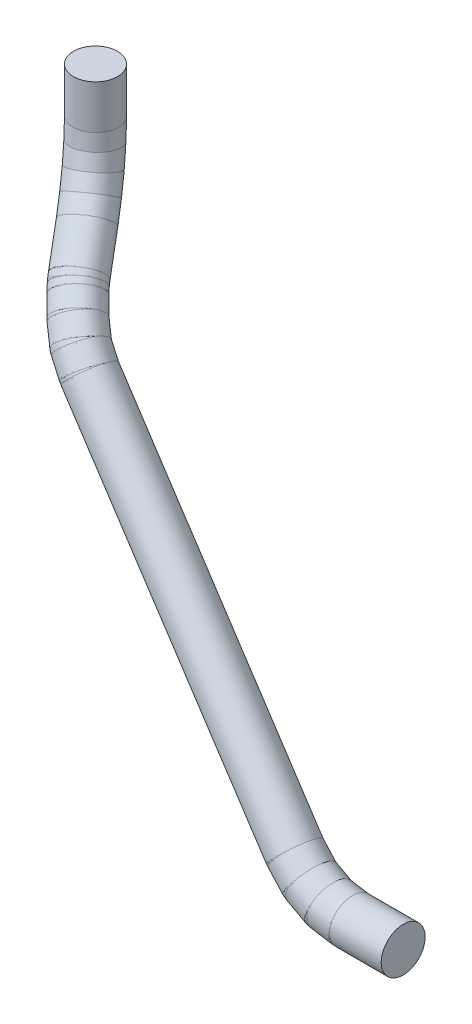
ISO-10303-21;
HEADER;
FILE_DESCRIPTION(('STEP AP214'),'2;1');
FILE_NAME('part.step','',(''),(''),'','','');
FILE_SCHEMA(('AUTOMOTIVE_DESIGN { 1 0 10303 214 1 1 1 1 }'));
ENDSEC;
DATA;
#1=APPLICATION_CONTEXT('core data for automotive mechanical design processes');
#2=APPLICATION_PROTOCOL_DEFINITION('international standard','automotive_design',2000,#1);
#3=PRODUCT_CONTEXT('',#1,'mechanical');
#4=PRODUCT('Part','Part','',(#3));
#5=PRODUCT_RELATED_PRODUCT_CATEGORY('part','',(#4));
#6=PRODUCT_DEFINITION_FORMATION('','',#4);
#7=PRODUCT_DEFINITION_CONTEXT('part definition',#1,'design');
#8=PRODUCT_DEFINITION('design','',#6,#7);
#9=PRODUCT_DEFINITION_SHAPE('','',#8);
#10=(LENGTH_UNIT() NAMED_UNIT(*) SI_UNIT(.MILLI.,.METRE.));
#11=(NAMED_UNIT(*) PLANE_ANGLE_UNIT() SI_UNIT($,.RADIAN.));
#12=(NAMED_UNIT(*) SI_UNIT($,.STERADIAN.) SOLID_ANGLE_UNIT());
#13=UNCERTAINTY_MEASURE_WITH_UNIT(LENGTH_MEASURE(1.E-05),#10,'distance_accuracy_value','');
#14=(GEOMETRIC_REPRESENTATION_CONTEXT(3) GLOBAL_UNCERTAINTY_ASSIGNED_CONTEXT((#13)) GLOBAL_UNIT_ASSIGNED_CONTEXT((#10,
#11,#12)) REPRESENTATION_CONTEXT('',''));
#15=CARTESIAN_POINT('',(0.,0.,0.));
#16=DIRECTION('',(0.,0.,1.));
#17=DIRECTION('',(1.,0.,0.));
#18=AXIS2_PLACEMENT_3D('',#15,#16,#17);
#19=CARTESIAN_POINT('',(-53.,-173.,205.));
#20=DIRECTION('',(-1.,0.,0.));
#21=DIRECTION('',(0.,0.,1.));
#22=AXIS2_PLACEMENT_3D('',#19,#20,#21);
#23=PLANE('',#22);
#24=CARTESIAN_POINT('',(-53.,-173.,205.));
#25=DIRECTION('',(-1.,0.,0.));
#26=DIRECTION('',(0.,0.,-1.));
#27=AXIS2_PLACEMENT_3D('',#24,#25,#26);
#28=CIRCLE('',#27,2.5);
#29=CARTESIAN_POINT('',(-53.,-173.,202.5));
#30=VERTEX_POINT('',#29);
#31=EDGE_CURVE('P0_E11',#30,#30,#28,.T.);
#32=ORIENTED_EDGE('',*,*,#31,.F.);
#33=EDGE_LOOP('',(#32));
#34=FACE_BOUND('',#33,.T.);
#35=ADVANCED_FACE('P0_F16',(#34),#23,.F.);
#36=CARTESIAN_POINT('',(-58.87238572424,-173.,205.));
#37=DIRECTION('',(-1.,0.,0.));
#38=DIRECTION('',(0.,0.,1.));
#39=AXIS2_PLACEMENT_3D('',#36,#37,#38);
#40=PLANE('',#39);
#41=CARTESIAN_POINT('',(-58.87238572424,-173.,205.));
#42=DIRECTION('',(-1.,0.,0.));
#43=DIRECTION('',(0.,0.,-1.));
#44=AXIS2_PLACEMENT_3D('',#41,#42,#43);
#45=CIRCLE('',#44,2.5);
#46=CARTESIAN_POINT('',(-58.87238572424,-173.,202.5));
#47=VERTEX_POINT('',#46);
#48=EDGE_CURVE('P0_E40',#47,#47,#45,.T.);
#49=ORIENTED_EDGE('',*,*,#48,.T.);
#50=EDGE_LOOP('',(#49));
#51=FACE_BOUND('',#50,.T.);
#52=ADVANCED_FACE('P0_F43',(#51),#40,.T.);
#53=CARTESIAN_POINT('',(-53.,-173.,205.));
#54=DIRECTION('',(-1.,0.,0.));
#55=DIRECTION('',(0.,0.,-1.));
#56=AXIS2_PLACEMENT_3D('',#53,#54,#55);
#57=CYLINDRICAL_SURFACE('',#56,2.5);
#58=ORIENTED_EDGE('',*,*,#48,.F.);
#59=DIRECTION('',(-1.,0.,0.));
#60=VECTOR('',#59,1.);
#61=CARTESIAN_POINT('',(-53.,-173.,202.5));
#62=LINE('',#61,#60);
#63=EDGE_CURVE('P0_E19',#30,#47,#62,.T.);
#64=ORIENTED_EDGE('',*,*,#63,.F.);
#65=ORIENTED_EDGE('',*,*,#31,.T.);
#66=ORIENTED_EDGE('',*,*,#63,.T.);
#67=EDGE_LOOP('',(#58,#64,#65,#66));
#68=FACE_BOUND('',#67,.T.);
#69=ADVANCED_FACE('P0_F39',(#68),#57,.T.);
#70=CLOSED_SHELL('',(#35,#52,#69));
#71=MANIFOLD_SOLID_BREP('P0_B1',#70);
#72=CARTESIAN_POINT('',(-58.87238572424,-173.,205.));
#73=DIRECTION('',(-0.991498732305096,0.126973144968012,-0.0284268235003328));
#74=DIRECTION('',(-0.0286587832479515,0.,0.999589252714707));
#75=AXIS2_PLACEMENT_3D('',#72,#73,#74);
#76=PLANE('',#75);
#77=CARTESIAN_POINT('',(-58.87238572424,-173.,205.));
#78=DIRECTION('',(-0.991498732305056,0.126973144968326,-0.0284268235003328));
#79=DIRECTION('',(-0.127024478583963,-0.991899582538713,0.));
#80=AXIS2_PLACEMENT_3D('',#77,#78,#79);
#81=CIRCLE('',#80,2.5);
#82=CARTESIAN_POINT('',(-59.1899469207,-175.4797489563,205.));
#83=VERTEX_POINT('',#82);
#84=EDGE_CURVE('P1_E11',#83,#83,#81,.T.);
#85=ORIENTED_EDGE('',*,*,#84,.F.);
#86=EDGE_LOOP('',(#85));
#87=FACE_BOUND('',#86,.T.);
#88=ADVANCED_FACE('P1_F16',(#87),#76,.F.);
#89=CARTESIAN_POINT('',(-61.45258959245,-172.6695743634,204.92602411121));
#90=DIRECTION('',(-0.991498732305096,0.126973144968012,-0.0284268235003328));
#91=DIRECTION('',(-0.0286587832479515,0.,0.999589252714707));
#92=AXIS2_PLACEMENT_3D('',#89,#90,#91);
#93=PLANE('',#92);
#94=CARTESIAN_POINT('',(-61.45258959245,-172.6695743634,204.92602411121));
#95=DIRECTION('',(-0.991498732305056,0.126973144968326,-0.0284268235003328));
#96=DIRECTION('',(-0.127024478583963,-0.991899582538713,0.));
#97=AXIS2_PLACEMENT_3D('',#94,#95,#96);
#98=CIRCLE('',#97,2.5);
#99=CARTESIAN_POINT('',(-61.77015078891,-175.1493233197,204.92602411121));
#100=VERTEX_POINT('',#99);
#101=EDGE_CURVE('P1_E19',#100,#100,#98,.T.);
#102=ORIENTED_EDGE('',*,*,#101,.T.);
#103=EDGE_LOOP('',(#102));
#104=FACE_BOUND('',#103,.T.);
#105=ADVANCED_FACE('P1_F44',(#104),#93,.T.);
#106=CARTESIAN_POINT('',(-58.87238572424,-173.,205.));
#107=DIRECTION('',(-0.991498732305056,0.126973144968326,-0.0284268235003328));
#108=DIRECTION('',(-0.127024478583963,-0.991899582538713,0.));
#109=AXIS2_PLACEMENT_3D('',#106,#107,#108);
#110=CYLINDRICAL_SURFACE('',#109,2.5);
#111=ORIENTED_EDGE('',*,*,#101,.F.);
#112=DIRECTION('',(-0.991498732305096,0.126973144968012,-0.0284268235003328));
#113=VECTOR('',#112,1.);
#114=CARTESIAN_POINT('',(-59.1899469207,-175.4797489563,205.));
#115=LINE('',#114,#113);
#116=EDGE_CURVE('P1_E25',#83,#100,#115,.T.);
#117=ORIENTED_EDGE('',*,*,#116,.F.);
#118=ORIENTED_EDGE('',*,*,#84,.T.);
#119=ORIENTED_EDGE('',*,*,#116,.T.);
#120=EDGE_LOOP('',(#111,#117,#118,#119));
#121=FACE_BOUND('',#120,.T.);
#122=ADVANCED_FACE('P1_F41',(#121),#110,.T.);
#123=CLOSED_SHELL('',(#88,#105,#122));
#124=MANIFOLD_SOLID_BREP('P1_B1',#123);
#125=CARTESIAN_POINT('',(-61.45258959245,-172.6695743634,204.92602411121));
#126=DIRECTION('',(-0.924353391775622,0.372320679525848,-0.0833553760132759));
#127=DIRECTION('',(-0.089812523834854,0.,0.995958689184654));
#128=AXIS2_PLACEMENT_3D('',#125,#126,#127);
#129=PLANE('',#128);
#130=CARTESIAN_POINT('',(-61.45258959245,-172.6695743634,204.92602411121));
#131=DIRECTION('',(-0.924353391775447,0.372320679526284,-0.0833553760132759));
#132=DIRECTION('',(-0.373620923289,-0.927581481963,0.));
#133=AXIS2_PLACEMENT_3D('',#130,#131,#132);
#134=CIRCLE('',#133,2.5);
#135=CARTESIAN_POINT('',(-62.38664190067,-174.9885280683,204.92602411121));
#136=VERTEX_POINT('',#135);
#137=EDGE_CURVE('P2_E11',#136,#136,#134,.T.);
#138=ORIENTED_EDGE('',*,*,#137,.F.);
#139=EDGE_LOOP('',(#138));
#140=FACE_BOUND('',#139,.T.);
#141=ADVANCED_FACE('P2_F16',(#140),#129,.F.);
#142=CARTESIAN_POINT('',(-63.85805933169,-171.7006742264,204.70910617009));
#143=DIRECTION('',(-0.924353391775622,0.372320679525848,-0.0833553760132759));
#144=DIRECTION('',(-0.089812523834854,0.,0.995958689184654));
#145=AXIS2_PLACEMENT_3D('',#142,#143,#144);
#146=PLANE('',#145);
#147=CARTESIAN_POINT('',(-63.85805933169,-171.7006742264,204.70910617009));
#148=DIRECTION('',(-0.924353391775447,0.372320679526284,-0.0833553760132759));
#149=DIRECTION('',(-0.373620923289,-0.927581481963,0.));
#150=AXIS2_PLACEMENT_3D('',#147,#148,#149);
#151=CIRCLE('',#150,2.5);
#152=CARTESIAN_POINT('',(-64.79211163991,-174.0196279313,204.70910617009));
#153=VERTEX_POINT('',#152);
#154=EDGE_CURVE('P2_E40',#153,#153,#151,.T.);
#155=ORIENTED_EDGE('',*,*,#154,.T.);
#156=EDGE_LOOP('',(#155));
#157=FACE_BOUND('',#156,.T.);
#158=ADVANCED_FACE('P2_F44',(#157),#146,.T.);
#159=CARTESIAN_POINT('',(-61.45258959245,-172.6695743634,204.92602411121));
#160=DIRECTION('',(-0.924353391775447,0.372320679526284,-0.0833553760132759));
#161=DIRECTION('',(-0.373620923289,-0.927581481963,0.));
#162=AXIS2_PLACEMENT_3D('',#159,#160,#161);
#163=CYLINDRICAL_SURFACE('',#162,2.5);
#164=ORIENTED_EDGE('',*,*,#154,.F.);
#165=DIRECTION('',(-0.924353391775622,0.372320679525848,-0.0833553760132759));
#166=VECTOR('',#165,1.);
#167=CARTESIAN_POINT('',(-62.38664190067,-174.9885280683,204.92602411121));
#168=LINE('',#167,#166);
#169=EDGE_CURVE('P2_E25',#136,#153,#168,.T.);
#170=ORIENTED_EDGE('',*,*,#169,.F.);
#171=ORIENTED_EDGE('',*,*,#137,.T.);
#172=ORIENTED_EDGE('',*,*,#169,.T.);
#173=EDGE_LOOP('',(#164,#170,#171,#172));
#174=FACE_BOUND('',#173,.T.);
#175=ADVANCED_FACE('P2_F39',(#174),#163,.T.);
#176=CLOSED_SHELL('',(#141,#158,#175));
#177=MANIFOLD_SOLID_BREP('P2_B1',#176);
#178=CARTESIAN_POINT('',(-63.85805933169,-171.7006742264,204.70910617009));
#179=DIRECTION('',(-0.794609864038896,0.592454264737922,-0.132639014493983));
#180=DIRECTION('',(-0.164645409222524,0.,0.986352821875594));
#181=AXIS2_PLACEMENT_3D('',#178,#179,#180);
#182=PLANE('',#181);
#183=CARTESIAN_POINT('',(-63.85805933169,-171.7006742264,204.70910617009));
#184=DIRECTION('',(-0.794609864039016,0.592454264737762,-0.132639014493983));
#185=DIRECTION('',(-0.597735610256958,-0.801693295612943,0.));
#186=AXIS2_PLACEMENT_3D('',#183,#184,#185);
#187=CIRCLE('',#186,2.5);
#188=CARTESIAN_POINT('',(-65.35239835733,-173.7049074654,204.70910617009));
#189=VERTEX_POINT('',#188);
#190=EDGE_CURVE('P3_E11',#189,#189,#187,.T.);
#191=ORIENTED_EDGE('',*,*,#190,.F.);
#192=EDGE_LOOP('',(#191));
#193=FACE_BOUND('',#192,.T.);
#194=ADVANCED_FACE('P3_F16',(#193),#182,.F.);
#195=CARTESIAN_POINT('',(-65.9258939926,-170.1589145289,204.36393608856));
#196=DIRECTION('',(-0.794609864038896,0.592454264737922,-0.132639014493983));
#197=DIRECTION('',(-0.164645409222524,0.,0.986352821875594));
#198=AXIS2_PLACEMENT_3D('',#195,#196,#197);
#199=PLANE('',#198);
#200=CARTESIAN_POINT('',(-65.9258939926,-170.1589145289,204.36393608856));
#201=DIRECTION('',(-0.794609864039016,0.592454264737762,-0.132639014493983));
#202=DIRECTION('',(-0.597735610256958,-0.801693295612943,0.));
#203=AXIS2_PLACEMENT_3D('',#200,#201,#202);
#204=CIRCLE('',#203,2.5);
#205=CARTESIAN_POINT('',(-67.42023301825,-172.1631477679,204.36393608856));
#206=VERTEX_POINT('',#205);
#207=EDGE_CURVE('P3_E40',#206,#206,#204,.T.);
#208=ORIENTED_EDGE('',*,*,#207,.T.);
#209=EDGE_LOOP('',(#208));
#210=FACE_BOUND('',#209,.T.);
#211=ADVANCED_FACE('P3_F44',(#210),#199,.T.);
#212=CARTESIAN_POINT('',(-63.85805933169,-171.7006742264,204.70910617009));
#213=DIRECTION('',(-0.794609864039016,0.592454264737762,-0.132639014493983));
#214=DIRECTION('',(-0.597735610256958,-0.801693295612943,0.));
#215=AXIS2_PLACEMENT_3D('',#212,#213,#214);
#216=CYLINDRICAL_SURFACE('',#215,2.5);
#217=ORIENTED_EDGE('',*,*,#207,.F.);
#218=DIRECTION('',(-0.794609864038896,0.592454264737923,-0.132639014493983));
#219=VECTOR('',#218,1.);
#220=CARTESIAN_POINT('',(-65.35239835733,-173.7049074654,204.70910617009));
#221=LINE('',#220,#219);
#222=EDGE_CURVE('P3_E25',#189,#206,#221,.T.);
#223=ORIENTED_EDGE('',*,*,#222,.F.);
#224=ORIENTED_EDGE('',*,*,#190,.T.);
#225=ORIENTED_EDGE('',*,*,#222,.T.);
#226=EDGE_LOOP('',(#217,#223,#224,#225));
#227=FACE_BOUND('',#226,.T.);
#228=ADVANCED_FACE('P3_F18',(#227),#216,.T.);
#229=CLOSED_SHELL('',(#194,#211,#228));
#230=MANIFOLD_SOLID_BREP('P3_B1',#229);
#231=CARTESIAN_POINT('',(-65.9258939926,-170.1589145289,204.36393608856));
#232=DIRECTION('',(-0.708858385774043,0.688311765896042,-0.15409964908101));
#233=DIRECTION('',(-0.212429644330643,0.,0.977176363922888));
#234=AXIS2_PLACEMENT_3D('',#231,#232,#233);
#235=PLANE('',#234);
#236=CARTESIAN_POINT('',(-65.9258939926,-170.1589145289,204.36393608856));
#237=DIRECTION('',(-0.70885838577409,0.688311765895993,-0.15409964908101));
#238=DIRECTION('',(-0.696632828179143,-0.717427837976147,0.));
#239=AXIS2_PLACEMENT_3D('',#236,#237,#238);
#240=CIRCLE('',#239,2.5);
#241=CARTESIAN_POINT('',(-67.66747606305,-171.9524841238,204.36393608856));
#242=VERTEX_POINT('',#241);
#243=EDGE_CURVE('P4_E11',#242,#242,#240,.T.);
#244=ORIENTED_EDGE('',*,*,#243,.F.);
#245=EDGE_LOOP('',(#244));
#246=FACE_BOUND('',#245,.T.);
#247=ADVANCED_FACE('P4_F16',(#246),#235,.F.);
#248=CARTESIAN_POINT('',(-95.83666687887,-141.1151205668,197.86159415676));
#249=DIRECTION('',(-0.708858385774043,0.688311765896042,-0.15409964908101));
#250=DIRECTION('',(-0.212429644330643,0.,0.977176363922888));
#251=AXIS2_PLACEMENT_3D('',#248,#249,#250);
#252=PLANE('',#251);
#253=CARTESIAN_POINT('',(-95.83666687887,-141.1151205668,197.86159415676));
#254=DIRECTION('',(-0.70885838577409,0.688311765895993,-0.15409964908101));
#255=DIRECTION('',(-0.696632828179143,-0.717427837976147,0.));
#256=AXIS2_PLACEMENT_3D('',#253,#254,#255);
#257=CIRCLE('',#256,2.5);
#258=CARTESIAN_POINT('',(-97.57824894932,-142.9086901618,197.86159415676));
#259=VERTEX_POINT('',#258);
#260=EDGE_CURVE('P4_E20',#259,#259,#257,.T.);
#261=ORIENTED_EDGE('',*,*,#260,.T.);
#262=EDGE_LOOP('',(#261));
#263=FACE_BOUND('',#262,.T.);
#264=ADVANCED_FACE('P4_F44',(#263),#252,.T.);
#265=CARTESIAN_POINT('',(-65.9258939926,-170.1589145289,204.36393608856));
#266=DIRECTION('',(-0.70885838577409,0.688311765895993,-0.15409964908101));
#267=DIRECTION('',(-0.696632828179143,-0.717427837976147,0.));
#268=AXIS2_PLACEMENT_3D('',#265,#266,#267);
#269=CYLINDRICAL_SURFACE('',#268,2.5);
#270=ORIENTED_EDGE('',*,*,#260,.F.);
#271=DIRECTION('',(-0.708858385774043,0.688311765896042,-0.15409964908101));
#272=VECTOR('',#271,1.);
#273=CARTESIAN_POINT('',(-67.66747606305,-171.9524841238,204.36393608856));
#274=LINE('',#273,#272);
#275=EDGE_CURVE('P4_E27',#242,#259,#274,.T.);
#276=ORIENTED_EDGE('',*,*,#275,.F.);
#277=ORIENTED_EDGE('',*,*,#243,.T.);
#278=ORIENTED_EDGE('',*,*,#275,.T.);
#279=EDGE_LOOP('',(#270,#276,#277,#278));
#280=FACE_BOUND('',#279,.T.);
#281=ADVANCED_FACE('P4_F18',(#280),#269,.T.);
#282=CLOSED_SHELL('',(#247,#264,#281));
#283=MANIFOLD_SOLID_BREP('P4_B1',#282);
#284=CARTESIAN_POINT('',(-95.83666687887,-141.1151205668,197.86159415676));
#285=DIRECTION('',(-0.689287029581941,0.673633721380942,-0.266647708162977));
#286=DIRECTION('',(-0.360790427810716,0.,0.93264691453956));
#287=AXIS2_PLACEMENT_3D('',#284,#285,#286);
#288=PLANE('',#287);
#289=CARTESIAN_POINT('',(-95.83666687887,-141.1151205668,197.86159415676));
#290=DIRECTION('',(-0.689287029581602,0.673633721381288,-0.266647708162977));
#291=DIRECTION('',(-0.698939478715806,-0.715180819857802,0.));
#292=AXIS2_PLACEMENT_3D('',#289,#290,#291);
#293=CIRCLE('',#292,2.5);
#294=CARTESIAN_POINT('',(-97.58401557566,-142.9030726165,197.86159415676));
#295=VERTEX_POINT('',#294);
#296=EDGE_CURVE('P5_E11',#295,#295,#293,.T.);
#297=ORIENTED_EDGE('',*,*,#296,.F.);
#298=EDGE_LOOP('',(#297));
#299=FACE_BOUND('',#298,.T.);
#300=ADVANCED_FACE('P5_F16',(#299),#288,.F.);
#301=CARTESIAN_POINT('',(-97.42182053998,-139.5659648249,197.2483843143));
#302=DIRECTION('',(-0.689287029581941,0.673633721380942,-0.266647708162977));
#303=DIRECTION('',(-0.360790427810716,0.,0.93264691453956));
#304=AXIS2_PLACEMENT_3D('',#301,#302,#303);
#305=PLANE('',#304);
#306=CARTESIAN_POINT('',(-97.42182053998,-139.5659648249,197.2483843143));
#307=DIRECTION('',(-0.689287029581602,0.673633721381288,-0.266647708162977));
#308=DIRECTION('',(-0.698939478715806,-0.715180819857802,0.));
#309=AXIS2_PLACEMENT_3D('',#306,#307,#308);
#310=CIRCLE('',#309,2.5);
#311=CARTESIAN_POINT('',(-99.16916923677,-141.3539168746,197.2483843143));
#312=VERTEX_POINT('',#311);
#313=EDGE_CURVE('P5_E40',#312,#312,#310,.T.);
#314=ORIENTED_EDGE('',*,*,#313,.T.);
#315=EDGE_LOOP('',(#314));
#316=FACE_BOUND('',#315,.T.);
#317=ADVANCED_FACE('P5_F44',(#316),#305,.T.);
#318=CARTESIAN_POINT('',(-95.83666687887,-141.1151205668,197.86159415676));
#319=DIRECTION('',(-0.689287029581602,0.673633721381288,-0.266647708162977));
#320=DIRECTION('',(-0.698939478715806,-0.715180819857802,0.));
#321=AXIS2_PLACEMENT_3D('',#318,#319,#320);
#322=CYLINDRICAL_SURFACE('',#321,2.5);
#323=ORIENTED_EDGE('',*,*,#313,.F.);
#324=DIRECTION('',(-0.689287029581941,0.673633721380942,-0.266647708162977));
#325=VECTOR('',#324,1.);
#326=CARTESIAN_POINT('',(-97.58401557566,-142.9030726165,197.86159415676));
#327=LINE('',#326,#325);
#328=EDGE_CURVE('P5_E25',#295,#312,#327,.T.);
#329=ORIENTED_EDGE('',*,*,#328,.F.);
#330=ORIENTED_EDGE('',*,*,#296,.T.);
#331=ORIENTED_EDGE('',*,*,#328,.T.);
#332=EDGE_LOOP('',(#323,#329,#330,#331));
#333=FACE_BOUND('',#332,.T.);
#334=ADVANCED_FACE('P5_F39',(#333),#322,.T.);
#335=CLOSED_SHELL('',(#300,#317,#334));
#336=MANIFOLD_SOLID_BREP('P5_B1',#335);
#337=CARTESIAN_POINT('',(-97.42182053998,-139.5659648249,197.2483843143));
#338=DIRECTION('',(-0.623093927383032,0.617782524646032,-0.479686053477025));
#339=DIRECTION('',(-0.610016738789293,0.,0.792388527426335));
#340=AXIS2_PLACEMENT_3D('',#337,#338,#339);
#341=PLANE('',#340);
#342=CARTESIAN_POINT('',(-97.42182053998,-139.5659648249,197.2483843143));
#343=DIRECTION('',(-0.62309392738321,0.617782524645854,-0.479686053477025));
#344=DIRECTION('',(-0.704073657046845,-0.710126950236844,0.));
#345=AXIS2_PLACEMENT_3D('',#342,#343,#344);
#346=CIRCLE('',#345,2.5);
#347=CARTESIAN_POINT('',(-99.1820046826,-141.3412822005,197.2483843143));
#348=VERTEX_POINT('',#347);
#349=EDGE_CURVE('P6_E11',#348,#348,#346,.T.);
#350=ORIENTED_EDGE('',*,*,#349,.F.);
#351=EDGE_LOOP('',(#350));
#352=FACE_BOUND('',#351,.T.);
#353=ADVANCED_FACE('P6_F16',(#352),#341,.F.);
#354=CARTESIAN_POINT('',(-98.85474989716,-138.1452501028,196.14525010283));
#355=DIRECTION('',(-0.623093927383032,0.617782524646032,-0.479686053477025));
#356=DIRECTION('',(-0.610016738789293,0.,0.792388527426335));
#357=AXIS2_PLACEMENT_3D('',#354,#355,#356);
#358=PLANE('',#357);
#359=CARTESIAN_POINT('',(-98.85474989716,-138.1452501028,196.14525010283));
#360=DIRECTION('',(-0.62309392738321,0.617782524645854,-0.479686053477025));
#361=DIRECTION('',(-0.704073657046845,-0.710126950236844,0.));
#362=AXIS2_PLACEMENT_3D('',#359,#360,#361);
#363=CIRCLE('',#362,2.5);
#364=CARTESIAN_POINT('',(-100.6149340397,-139.9205674784,196.14525010283));
#365=VERTEX_POINT('',#364);
#366=EDGE_CURVE('P6_E40',#365,#365,#363,.T.);
#367=ORIENTED_EDGE('',*,*,#366,.T.);
#368=EDGE_LOOP('',(#367));
#369=FACE_BOUND('',#368,.T.);
#370=ADVANCED_FACE('P6_F43',(#369),#358,.T.);
#371=CARTESIAN_POINT('',(-97.42182053998,-139.5659648249,197.2483843143));
#372=DIRECTION('',(-0.62309392738321,0.617782524645854,-0.479686053477025));
#373=DIRECTION('',(-0.704073657046845,-0.710126950236844,0.));
#374=AXIS2_PLACEMENT_3D('',#371,#372,#373);
#375=CYLINDRICAL_SURFACE('',#374,2.5);
#376=ORIENTED_EDGE('',*,*,#366,.F.);
#377=DIRECTION('',(-0.623093927383032,0.617782524646032,-0.479686053477025));
#378=VECTOR('',#377,1.);
#379=CARTESIAN_POINT('',(-99.1820046826,-141.3412822005,197.2483843143));
#380=LINE('',#379,#378);
#381=EDGE_CURVE('P6_E25',#348,#365,#380,.T.);
#382=ORIENTED_EDGE('',*,*,#381,.F.);
#383=ORIENTED_EDGE('',*,*,#349,.T.);
#384=ORIENTED_EDGE('',*,*,#381,.T.);
#385=EDGE_LOOP('',(#376,#382,#383,#384));
#386=FACE_BOUND('',#385,.T.);
#387=ADVANCED_FACE('P6_F39',(#386),#375,.T.);
#388=CLOSED_SHELL('',(#353,#370,#387));
#389=MANIFOLD_SOLID_BREP('P6_B1',#388);
#390=CARTESIAN_POINT('',(-98.85474989716,-138.1452501028,196.14525010283));
#391=DIRECTION('',(-0.577350269189626,0.577350269189626,-0.577350269189626));
#392=DIRECTION('',(-0.707106781186548,0.,0.707106781186548));
#393=AXIS2_PLACEMENT_3D('',#390,#391,#392);
#394=PLANE('',#393);
#395=CARTESIAN_POINT('',(-98.85474989716,-138.1452501028,196.14525010283));
#396=DIRECTION('',(-0.577350269189626,0.577350269189626,-0.577350269189626));
#397=DIRECTION('',(0.707106781186548,0.,-0.707106781186548));
#398=AXIS2_PLACEMENT_3D('',#395,#396,#397);
#399=CIRCLE('',#398,2.5);
#400=CARTESIAN_POINT('',(-97.0869829442,-138.1452501028,194.37748314986));
#401=VERTEX_POINT('',#400);
#402=EDGE_CURVE('P7_E11',#401,#401,#399,.T.);
#403=ORIENTED_EDGE('',*,*,#402,.F.);
#404=EDGE_LOOP('',(#403));
#405=FACE_BOUND('',#404,.T.);
#406=ADVANCED_FACE('P7_F16',(#405),#394,.F.);
#407=CARTESIAN_POINT('',(-100.0524807071,-136.9475192928,194.94751929283));
#408=DIRECTION('',(-0.577350269189626,0.577350269189626,-0.577350269189626));
#409=DIRECTION('',(-0.707106781186548,0.,0.707106781186548));
#410=AXIS2_PLACEMENT_3D('',#407,#408,#409);
#411=PLANE('',#410);
#412=CARTESIAN_POINT('',(-100.0524807071,-136.9475192928,194.94751929283));
#413=DIRECTION('',(-0.577350269189626,0.577350269189626,-0.577350269189626));
#414=DIRECTION('',(0.707106781186548,0.,-0.707106781186548));
#415=AXIS2_PLACEMENT_3D('',#412,#413,#414);
#416=CIRCLE('',#415,2.5);
#417=CARTESIAN_POINT('',(-98.28471375419,-136.9475192928,193.17975233987));
#418=VERTEX_POINT('',#417);
#419=EDGE_CURVE('P7_E42',#418,#418,#416,.T.);
#420=ORIENTED_EDGE('',*,*,#419,.T.);
#421=EDGE_LOOP('',(#420));
#422=FACE_BOUND('',#421,.T.);
#423=ADVANCED_FACE('P7_F18',(#422),#411,.T.);
#424=CARTESIAN_POINT('',(-98.85474989716,-138.1452501028,196.14525010283));
#425=DIRECTION('',(-0.577350269189626,0.577350269189626,-0.577350269189626));
#426=DIRECTION('',(0.707106781186548,0.,-0.707106781186548));
#427=AXIS2_PLACEMENT_3D('',#424,#425,#426);
#428=CYLINDRICAL_SURFACE('',#427,2.5);
#429=ORIENTED_EDGE('',*,*,#419,.F.);
#430=DIRECTION('',(-0.577350269189626,0.577350269189626,-0.577350269189626));
#431=VECTOR('',#430,1.);
#432=CARTESIAN_POINT('',(-97.0869829442,-138.1452501028,194.37748314986));
#433=LINE('',#432,#431);
#434=EDGE_CURVE('P7_E20',#401,#418,#433,.T.);
#435=ORIENTED_EDGE('',*,*,#434,.F.);
#436=ORIENTED_EDGE('',*,*,#402,.T.);
#437=ORIENTED_EDGE('',*,*,#434,.T.);
#438=EDGE_LOOP('',(#429,#435,#436,#437));
#439=FACE_BOUND('',#438,.T.);
#440=ADVANCED_FACE('P7_F41',(#439),#428,.T.);
#441=CLOSED_SHELL('',(#406,#423,#440));
#442=MANIFOLD_SOLID_BREP('P7_B1',#441);
#443=CARTESIAN_POINT('',(-100.0524807071,-136.9475192928,194.94751929283));
#444=DIRECTION('',(-0.54547545539505,0.590157601325054,-0.595122284207054));
#445=DIRECTION('',(-0.737187029679512,0.,0.675688747332896));
#446=AXIS2_PLACEMENT_3D('',#443,#444,#445);
#447=PLANE('',#446);
#448=CARTESIAN_POINT('',(-100.0524807071,-136.9475192928,194.94751929283));
#449=DIRECTION('',(-0.54547545539505,0.590157601325429,-0.595122284206682));
#450=DIRECTION('',(0.,-0.710062351494822,-0.704138805200824));
#451=AXIS2_PLACEMENT_3D('',#448,#449,#450);
#452=CIRCLE('',#451,2.5);
#453=CARTESIAN_POINT('',(-100.0524807071,-138.7226751715,193.18717227983));
#454=VERTEX_POINT('',#453);
#455=EDGE_CURVE('P8_E11',#454,#454,#452,.T.);
#456=ORIENTED_EDGE('',*,*,#455,.F.);
#457=EDGE_LOOP('',(#456));
#458=FACE_BOUND('',#457,.T.);
#459=ADVANCED_FACE('P8_F16',(#458),#447,.F.);
#460=CARTESIAN_POINT('',(-100.4743440493,-136.491099383,194.48725976447));
#461=DIRECTION('',(-0.54547545539505,0.590157601325054,-0.595122284207054));
#462=DIRECTION('',(-0.737187029679512,0.,0.675688747332896));
#463=AXIS2_PLACEMENT_3D('',#460,#461,#462);
#464=PLANE('',#463);
#465=CARTESIAN_POINT('',(-100.4743440493,-136.491099383,194.48725976447));
#466=DIRECTION('',(-0.54547545539505,0.590157601325429,-0.595122284206682));
#467=DIRECTION('',(0.,-0.710062351494822,-0.704138805200824));
#468=AXIS2_PLACEMENT_3D('',#465,#466,#467);
#469=CIRCLE('',#468,2.5);
#470=CARTESIAN_POINT('',(-100.4743440493,-138.2662552618,192.72691275147));
#471=VERTEX_POINT('',#470);
#472=EDGE_CURVE('P8_E20',#471,#471,#469,.T.);
#473=ORIENTED_EDGE('',*,*,#472,.T.);
#474=EDGE_LOOP('',(#473));
#475=FACE_BOUND('',#474,.T.);
#476=ADVANCED_FACE('P8_F44',(#475),#464,.T.);
#477=CARTESIAN_POINT('',(-100.0524807071,-136.9475192928,194.94751929283));
#478=DIRECTION('',(-0.54547545539505,0.590157601325429,-0.595122284206682));
#479=DIRECTION('',(0.,-0.710062351494822,-0.704138805200824));
#480=AXIS2_PLACEMENT_3D('',#477,#478,#479);
#481=CYLINDRICAL_SURFACE('',#480,2.5);
#482=ORIENTED_EDGE('',*,*,#472,.F.);
#483=DIRECTION('',(-0.54547545539505,0.590157601325054,-0.595122284207054));
#484=VECTOR('',#483,1.);
#485=CARTESIAN_POINT('',(-100.0524807071,-138.7226751715,193.18717227983));
#486=LINE('',#485,#484);
#487=EDGE_CURVE('P8_E27',#454,#471,#486,.T.);
#488=ORIENTED_EDGE('',*,*,#487,.F.);
#489=ORIENTED_EDGE('',*,*,#455,.T.);
#490=ORIENTED_EDGE('',*,*,#487,.T.);
#491=EDGE_LOOP('',(#482,#488,#489,#490));
#492=FACE_BOUND('',#491,.T.);
#493=ADVANCED_FACE('P8_F18',(#492),#481,.T.);
#494=CLOSED_SHELL('',(#459,#476,#493));
#495=MANIFOLD_SOLID_BREP('P8_B1',#494);
#496=CARTESIAN_POINT('',(-100.4743440493,-136.491099383,194.48725976447));
#497=DIRECTION('',(-0.47932683818292,0.613106020151898,-0.627970373704895));
#498=DIRECTION('',(-0.794898565256991,0.,0.606742343134528));
#499=AXIS2_PLACEMENT_3D('',#496,#497,#498);
#500=PLANE('',#499);
#501=CARTESIAN_POINT('',(-100.4743440493,-136.491099383,194.48725976447));
#502=DIRECTION('',(-0.47932683818292,0.613106020152429,-0.627970373704376));
#503=DIRECTION('',(0.,-0.715524470112668,-0.698587669995675));
#504=AXIS2_PLACEMENT_3D('',#501,#502,#503);
#505=CIRCLE('',#504,2.5);
#506=CARTESIAN_POINT('',(-100.4743440493,-138.2799105583,192.74079058948));
#507=VERTEX_POINT('',#506);
#508=EDGE_CURVE('P9_E11',#507,#507,#505,.T.);
#509=ORIENTED_EDGE('',*,*,#508,.F.);
#510=EDGE_LOOP('',(#509));
#511=FACE_BOUND('',#510,.T.);
#512=ADVANCED_FACE('P9_F16',(#511),#500,.F.);
#513=CARTESIAN_POINT('',(-100.8450489453,-136.0169314765,194.00159596781));
#514=DIRECTION('',(-0.47932683818292,0.613106020151898,-0.627970373704895));
#515=DIRECTION('',(-0.794898565256991,0.,0.606742343134528));
#516=AXIS2_PLACEMENT_3D('',#513,#514,#515);
#517=PLANE('',#516);
#518=CARTESIAN_POINT('',(-100.8450489453,-136.0169314765,194.00159596781));
#519=DIRECTION('',(-0.47932683818292,0.613106020152429,-0.627970373704376));
#520=DIRECTION('',(0.,-0.715524470112668,-0.698587669995675));
#521=AXIS2_PLACEMENT_3D('',#518,#519,#520);
#522=CIRCLE('',#521,2.5);
#523=CARTESIAN_POINT('',(-100.8450489453,-137.8057426517,192.25512679283));
#524=VERTEX_POINT('',#523);
#525=EDGE_CURVE('P9_E40',#524,#524,#522,.T.);
#526=ORIENTED_EDGE('',*,*,#525,.T.);
#527=EDGE_LOOP('',(#526));
#528=FACE_BOUND('',#527,.T.);
#529=ADVANCED_FACE('P9_F43',(#528),#517,.T.);
#530=CARTESIAN_POINT('',(-100.4743440493,-136.491099383,194.48725976447));
#531=DIRECTION('',(-0.47932683818292,0.61310602015243,-0.627970373704376));
#532=DIRECTION('',(0.,-0.715524470112668,-0.698587669995675));
#533=AXIS2_PLACEMENT_3D('',#530,#531,#532);
#534=CYLINDRICAL_SURFACE('',#533,2.5);
#535=ORIENTED_EDGE('',*,*,#525,.F.);
#536=DIRECTION('',(-0.47932683818292,0.613106020151898,-0.627970373704895));
#537=VECTOR('',#536,1.);
#538=CARTESIAN_POINT('',(-100.4743440493,-138.2799105583,192.74079058948));
#539=LINE('',#538,#537);
#540=EDGE_CURVE('P9_E26',#507,#524,#539,.T.);
#541=ORIENTED_EDGE('',*,*,#540,.F.);
#542=ORIENTED_EDGE('',*,*,#508,.T.);
#543=ORIENTED_EDGE('',*,*,#540,.T.);
#544=EDGE_LOOP('',(#535,#541,#542,#543));
#545=FACE_BOUND('',#544,.T.);
#546=ADVANCED_FACE('P9_F18',(#545),#534,.T.);
#547=CLOSED_SHELL('',(#512,#529,#546));
#548=MANIFOLD_SOLID_BREP('P9_B1',#547);
#549=CARTESIAN_POINT('',(-100.8450489453,-136.0169314765,194.00159596781));
#550=DIRECTION('',(-0.445151984895871,0.62321277885382,-0.642997311515814));
#551=DIRECTION('',(-0.822192191643595,0.,0.569209978830574));
#552=AXIS2_PLACEMENT_3D('',#549,#550,#551);
#553=PLANE('',#552);
#554=CARTESIAN_POINT('',(-100.8450489453,-136.0169314765,194.00159596781));
#555=DIRECTION('',(-0.445151984895871,0.623212778854067,-0.642997311515575));
#556=DIRECTION('',(0.,-0.718067675246157,-0.695973285239153));
#557=AXIS2_PLACEMENT_3D('',#554,#555,#556);
#558=CIRCLE('',#557,2.5);
#559=CARTESIAN_POINT('',(-100.8450489453,-137.8121006646,192.26166275472));
#560=VERTEX_POINT('',#559);
#561=EDGE_CURVE('P10_E11',#560,#560,#558,.T.);
#562=ORIENTED_EDGE('',*,*,#561,.F.);
#563=EDGE_LOOP('',(#562));
#564=FACE_BOUND('',#563,.T.);
#565=ADVANCED_FACE('P10_F16',(#564),#553,.F.);
#566=CARTESIAN_POINT('',(-102.8552895382,-133.2025946464,191.09791511137));
#567=DIRECTION('',(-0.445151984895871,0.62321277885382,-0.642997311515814));
#568=DIRECTION('',(-0.822192191643595,0.,0.569209978830574));
#569=AXIS2_PLACEMENT_3D('',#566,#567,#568);
#570=PLANE('',#569);
#571=CARTESIAN_POINT('',(-102.8552895382,-133.2025946464,191.09791511137));
#572=DIRECTION('',(-0.445151984895871,0.623212778854067,-0.642997311515575));
#573=DIRECTION('',(0.,-0.718067675246157,-0.695973285239153));
#574=AXIS2_PLACEMENT_3D('',#571,#572,#573);
#575=CIRCLE('',#574,2.5);
#576=CARTESIAN_POINT('',(-102.8552895382,-134.9977638345,189.35798189827));
#577=VERTEX_POINT('',#576);
#578=EDGE_CURVE('P10_E41',#577,#577,#575,.T.);
#579=ORIENTED_EDGE('',*,*,#578,.T.);
#580=EDGE_LOOP('',(#579));
#581=FACE_BOUND('',#580,.T.);
#582=ADVANCED_FACE('P10_F44',(#581),#570,.T.);
#583=CARTESIAN_POINT('',(-100.8450489453,-136.0169314765,194.00159596781));
#584=DIRECTION('',(-0.445151984895871,0.623212778854067,-0.642997311515575));
#585=DIRECTION('',(0.,-0.718067675246157,-0.695973285239153));
#586=AXIS2_PLACEMENT_3D('',#583,#584,#585);
#587=CYLINDRICAL_SURFACE('',#586,2.5);
#588=ORIENTED_EDGE('',*,*,#578,.F.);
#589=DIRECTION('',(-0.445151984895871,0.62321277885382,-0.642997311515814));
#590=VECTOR('',#589,1.);
#591=CARTESIAN_POINT('',(-100.8450489453,-137.8121006646,192.26166275472));
#592=LINE('',#591,#590);
#593=EDGE_CURVE('P10_E19',#560,#577,#592,.T.);
#594=ORIENTED_EDGE('',*,*,#593,.F.);
#595=ORIENTED_EDGE('',*,*,#561,.T.);
#596=ORIENTED_EDGE('',*,*,#593,.T.);
#597=EDGE_LOOP('',(#588,#594,#595,#596));
#598=FACE_BOUND('',#597,.T.);
#599=ADVANCED_FACE('P10_F40',(#598),#587,.T.);
#600=CLOSED_SHELL('',(#565,#582,#599));
#601=MANIFOLD_SOLID_BREP('P10_B1',#600);
#602=CARTESIAN_POINT('',(-102.8552895382,-133.2025946464,191.09791511137));
#603=DIRECTION('',(-0.402616985670062,0.706887550319109,-0.58155786819009));
#604=DIRECTION('',(-0.822192191643779,0.,0.569209978830308));
#605=AXIS2_PLACEMENT_3D('',#602,#603,#604);
#606=PLANE('',#605);
#607=CARTESIAN_POINT('',(-102.8552895382,-133.2025946464,191.09791511137));
#608=DIRECTION('',(-0.402616985670062,0.706887550319137,-0.581557868190056));
#609=DIRECTION('',(0.,0.635326475822189,0.772243659164229));
#610=AXIS2_PLACEMENT_3D('',#607,#608,#609);
#611=CIRCLE('',#610,2.5);
#612=CARTESIAN_POINT('',(-102.8552895382,-131.6142784568,193.02852425928));
#613=VERTEX_POINT('',#612);
#614=EDGE_CURVE('P11_E11',#613,#613,#611,.T.);
#615=ORIENTED_EDGE('',*,*,#614,.F.);
#616=EDGE_LOOP('',(#615));
#617=FACE_BOUND('',#616,.T.);
#618=ADVANCED_FACE('P11_F16',(#617),#606,.F.);
#619=CARTESIAN_POINT('',(-103.7572198861,-131.6190466172,189.79512683112));
#620=DIRECTION('',(-0.402616985670062,0.706887550319109,-0.58155786819009));
#621=DIRECTION('',(-0.822192191643779,0.,0.569209978830308));
#622=AXIS2_PLACEMENT_3D('',#619,#620,#621);
#623=PLANE('',#622);
#624=CARTESIAN_POINT('',(-103.7572198861,-131.6190466172,189.79512683112));
#625=DIRECTION('',(-0.402616985670062,0.706887550319137,-0.581557868190056));
#626=DIRECTION('',(0.,0.635326475822189,0.772243659164229));
#627=AXIS2_PLACEMENT_3D('',#624,#625,#626);
#628=CIRCLE('',#627,2.5);
#629=CARTESIAN_POINT('',(-103.7572198861,-130.0307304276,191.72573597903));
#630=VERTEX_POINT('',#629);
#631=EDGE_CURVE('P11_E40',#630,#630,#628,.T.);
#632=ORIENTED_EDGE('',*,*,#631,.T.);
#633=EDGE_LOOP('',(#632));
#634=FACE_BOUND('',#633,.T.);
#635=ADVANCED_FACE('P11_F44',(#634),#623,.T.);
#636=CARTESIAN_POINT('',(-102.8552895382,-133.2025946464,191.09791511137));
#637=DIRECTION('',(-0.402616985670062,0.706887550319137,-0.581557868190056));
#638=DIRECTION('',(0.,0.635326475822189,0.772243659164229));
#639=AXIS2_PLACEMENT_3D('',#636,#637,#638);
#640=CYLINDRICAL_SURFACE('',#639,2.5);
#641=ORIENTED_EDGE('',*,*,#631,.F.);
#642=DIRECTION('',(-0.402616985670062,0.706887550319109,-0.58155786819009));
#643=VECTOR('',#642,1.);
#644=CARTESIAN_POINT('',(-102.8552895382,-131.6142784568,193.02852425928));
#645=LINE('',#644,#643);
#646=EDGE_CURVE('P11_E24',#613,#630,#645,.T.);
#647=ORIENTED_EDGE('',*,*,#646,.F.);
#648=ORIENTED_EDGE('',*,*,#614,.T.);
#649=ORIENTED_EDGE('',*,*,#646,.T.);
#650=EDGE_LOOP('',(#641,#647,#648,#649));
#651=FACE_BOUND('',#650,.T.);
#652=ADVANCED_FACE('P11_F39',(#651),#640,.T.);
#653=CLOSED_SHELL('',(#618,#635,#652));
#654=MANIFOLD_SOLID_BREP('P11_B1',#653);
#655=CARTESIAN_POINT('',(-103.7572198861,-131.6190466172,189.79512683112));
#656=DIRECTION('',(-0.302944677134144,0.846606374705404,-0.437586755860209));
#657=DIRECTION('',(-0.822192191643643,0.,0.569209978830504));
#658=AXIS2_PLACEMENT_3D('',#655,#656,#657);
#659=PLANE('',#658);
#660=CARTESIAN_POINT('',(-103.7572198861,-131.6190466172,189.79512683112));
#661=DIRECTION('',(-0.302944677134144,0.846606374705281,-0.437586755860447));
#662=DIRECTION('',(0.,0.459163710824075,0.888351668351146));
#663=AXIS2_PLACEMENT_3D('',#660,#661,#662);
#664=CIRCLE('',#663,2.5);
#665=CARTESIAN_POINT('',(-103.7572198861,-130.4711373401,192.016006002));
#666=VERTEX_POINT('',#665);
#667=EDGE_CURVE('P12_E11',#666,#666,#664,.T.);
#668=ORIENTED_EDGE('',*,*,#667,.F.);
#669=EDGE_LOOP('',(#668));
#670=FACE_BOUND('',#669,.T.);
#671=ADVANCED_FACE('P12_F16',(#670),#659,.F.);
#672=CARTESIAN_POINT('',(-104.4358673544,-129.7225047195,188.81485826575));
#673=DIRECTION('',(-0.302944677134144,0.846606374705404,-0.437586755860209));
#674=DIRECTION('',(-0.822192191643643,0.,0.569209978830504));
#675=AXIS2_PLACEMENT_3D('',#672,#673,#674);
#676=PLANE('',#675);
#677=CARTESIAN_POINT('',(-104.4358673544,-129.7225047195,188.81485826575));
#678=DIRECTION('',(-0.302944677134144,0.846606374705281,-0.437586755860447));
#679=DIRECTION('',(0.,0.459163710824075,0.888351668351146));
#680=AXIS2_PLACEMENT_3D('',#677,#678,#679);
#681=CIRCLE('',#680,2.5);
#682=CARTESIAN_POINT('',(-104.4358673544,-128.5745954425,191.03573743663));
#683=VERTEX_POINT('',#682);
#684=EDGE_CURVE('P12_E40',#683,#683,#681,.T.);
#685=ORIENTED_EDGE('',*,*,#684,.T.);
#686=EDGE_LOOP('',(#685));
#687=FACE_BOUND('',#686,.T.);
#688=ADVANCED_FACE('P12_F43',(#687),#676,.T.);
#689=CARTESIAN_POINT('',(-103.7572198861,-131.6190466172,189.79512683112));
#690=DIRECTION('',(-0.302944677134144,0.846606374705281,-0.437586755860447));
#691=DIRECTION('',(0.,0.459163710824075,0.888351668351146));
#692=AXIS2_PLACEMENT_3D('',#689,#690,#691);
#693=CYLINDRICAL_SURFACE('',#692,2.5);
#694=ORIENTED_EDGE('',*,*,#684,.F.);
#695=DIRECTION('',(-0.302944677134144,0.846606374705404,-0.437586755860209));
#696=VECTOR('',#695,1.);
#697=CARTESIAN_POINT('',(-103.7572198861,-130.4711373401,192.016006002));
#698=LINE('',#697,#696);
#699=EDGE_CURVE('P12_E25',#666,#683,#698,.T.);
#700=ORIENTED_EDGE('',*,*,#699,.F.);
#701=ORIENTED_EDGE('',*,*,#667,.T.);
#702=ORIENTED_EDGE('',*,*,#699,.T.);
#703=EDGE_LOOP('',(#694,#700,#701,#702));
#704=FACE_BOUND('',#703,.T.);
#705=ADVANCED_FACE('P12_F18',(#704),#693,.T.);
#706=CLOSED_SHELL('',(#671,#688,#705));
#707=MANIFOLD_SOLID_BREP('P12_B1',#706);
#708=CARTESIAN_POINT('',(-104.4358673544,-129.7225047195,188.81485826575));
#709=DIRECTION('',(-0.188069514049923,0.94383944328861,-0.271655964737888));
#710=DIRECTION('',(-0.822192191642907,0.,0.569209978831567));
#711=AXIS2_PLACEMENT_3D('',#708,#709,#710);
#712=PLANE('',#711);
#713=CARTESIAN_POINT('',(-104.4358673544,-129.7225047195,188.81485826575));
#714=DIRECTION('',(-0.188069514049923,0.943839443288438,-0.271655964738486));
#715=DIRECTION('',(0.,0.276591541716991,0.960987574867968));
#716=AXIS2_PLACEMENT_3D('',#713,#714,#715);
#717=CIRCLE('',#716,2.5);
#718=CARTESIAN_POINT('',(-104.4358673544,-129.0310258652,191.21732720292));
#719=VERTEX_POINT('',#718);
#720=EDGE_CURVE('P13_E11',#719,#719,#717,.T.);
#721=ORIENTED_EDGE('',*,*,#720,.F.);
#722=EDGE_LOOP('',(#721));
#723=FACE_BOUND('',#722,.T.);
#724=ADVANCED_FACE('P13_F16',(#723),#712,.F.);
#725=CARTESIAN_POINT('',(-104.85717497,-127.6081442536,188.206302821));
#726=DIRECTION('',(-0.188069514049923,0.94383944328861,-0.271655964737888));
#727=DIRECTION('',(-0.822192191642907,0.,0.569209978831567));
#728=AXIS2_PLACEMENT_3D('',#725,#726,#727);
#729=PLANE('',#728);
#730=CARTESIAN_POINT('',(-104.85717497,-127.6081442536,188.206302821));
#731=DIRECTION('',(-0.188069514049923,0.943839443288438,-0.271655964738486));
#732=DIRECTION('',(0.,0.276591541716991,0.960987574867968));
#733=AXIS2_PLACEMENT_3D('',#730,#731,#732);
#734=CIRCLE('',#733,2.5);
#735=CARTESIAN_POINT('',(-104.85717497,-126.9166653993,190.60877175817));
#736=VERTEX_POINT('',#735);
#737=EDGE_CURVE('P13_E41',#736,#736,#734,.T.);
#738=ORIENTED_EDGE('',*,*,#737,.T.);
#739=EDGE_LOOP('',(#738));
#740=FACE_BOUND('',#739,.T.);
#741=ADVANCED_FACE('P13_F44',(#740),#729,.T.);
#742=CARTESIAN_POINT('',(-104.4358673544,-129.7225047195,188.81485826575));
#743=DIRECTION('',(-0.188069514049923,0.943839443288438,-0.271655964738486));
#744=DIRECTION('',(0.,0.276591541716991,0.960987574867968));
#745=AXIS2_PLACEMENT_3D('',#742,#743,#744);
#746=CYLINDRICAL_SURFACE('',#745,2.5);
#747=ORIENTED_EDGE('',*,*,#737,.F.);
#748=DIRECTION('',(-0.188069514049923,0.94383944328861,-0.271655964737888));
#749=VECTOR('',#748,1.);
#750=CARTESIAN_POINT('',(-104.4358673544,-129.0310258652,191.21732720292));
#751=LINE('',#750,#749);
#752=EDGE_CURVE('P13_E19',#719,#736,#751,.T.);
#753=ORIENTED_EDGE('',*,*,#752,.F.);
#754=ORIENTED_EDGE('',*,*,#720,.T.);
#755=ORIENTED_EDGE('',*,*,#752,.T.);
#756=EDGE_LOOP('',(#747,#753,#754,#755));
#757=FACE_BOUND('',#756,.T.);
#758=ADVANCED_FACE('P13_F40',(#757),#746,.T.);
#759=CLOSED_SHELL('',(#724,#741,#758));
#760=MANIFOLD_SOLID_BREP('P13_B1',#759);
#761=CARTESIAN_POINT('',(-104.85717497,-127.6081442536,188.206302821));
#762=DIRECTION('',(-0.0637563456695475,0.993707250632429,-0.0920924993004597));
#763=DIRECTION('',(-0.822192191643785,0.,0.569209978830299));
#764=AXIS2_PLACEMENT_3D('',#761,#762,#763);
#765=PLANE('',#764);
#766=CARTESIAN_POINT('',(-104.85717497,-127.6081442536,188.206302821));
#767=DIRECTION('',(-0.0637563456695475,0.993707250632432,-0.0920924993004203));
#768=DIRECTION('',(0.,0.0922802439562349,0.995733074963054));
#769=AXIS2_PLACEMENT_3D('',#766,#767,#768);
#770=CIRCLE('',#769,2.5);
#771=CARTESIAN_POINT('',(-104.85717497,-127.3774436437,190.69563550841));
#772=VERTEX_POINT('',#771);
#773=EDGE_CURVE('P14_E11',#772,#772,#770,.T.);
#774=ORIENTED_EDGE('',*,*,#773,.F.);
#775=EDGE_LOOP('',(#774));
#776=FACE_BOUND('',#775,.T.);
#777=ADVANCED_FACE('P14_F16',(#776),#765,.F.);
#778=CARTESIAN_POINT('',(-105.,-125.3820714396,188.));
#779=DIRECTION('',(-0.0637563456695475,0.993707250632429,-0.0920924993004597));
#780=DIRECTION('',(-0.822192191643785,0.,0.569209978830299));
#781=AXIS2_PLACEMENT_3D('',#778,#779,#780);
#782=PLANE('',#781);
#783=CARTESIAN_POINT('',(-105.,-125.3820714396,188.));
#784=DIRECTION('',(-0.0637563456695475,0.993707250632432,-0.0920924993004203));
#785=DIRECTION('',(0.,0.0922802439562349,0.995733074963054));
#786=AXIS2_PLACEMENT_3D('',#783,#784,#785);
#787=CIRCLE('',#786,2.5);
#788=CARTESIAN_POINT('',(-105.,-125.1513708297,190.4893326874));
#789=VERTEX_POINT('',#788);
#790=EDGE_CURVE('P14_E19',#789,#789,#787,.T.);
#791=ORIENTED_EDGE('',*,*,#790,.T.);
#792=EDGE_LOOP('',(#791));
#793=FACE_BOUND('',#792,.T.);
#794=ADVANCED_FACE('P14_F44',(#793),#782,.T.);
#795=CARTESIAN_POINT('',(-104.85717497,-127.6081442536,188.206302821));
#796=DIRECTION('',(-0.0637563456695475,0.993707250632432,-0.0920924993004203));
#797=DIRECTION('',(0.,0.092280243956235,0.995733074963054));
#798=AXIS2_PLACEMENT_3D('',#795,#796,#797);
#799=CYLINDRICAL_SURFACE('',#798,2.5);
#800=ORIENTED_EDGE('',*,*,#790,.F.);
#801=DIRECTION('',(-0.0637563456695475,0.993707250632429,-0.0920924993004597));
#802=VECTOR('',#801,1.);
#803=CARTESIAN_POINT('',(-104.85717497,-127.3774436437,190.69563550841));
#804=LINE('',#803,#802);
#805=EDGE_CURVE('P14_E25',#772,#789,#804,.T.);
#806=ORIENTED_EDGE('',*,*,#805,.F.);
#807=ORIENTED_EDGE('',*,*,#773,.T.);
#808=ORIENTED_EDGE('',*,*,#805,.T.);
#809=EDGE_LOOP('',(#800,#806,#807,#808));
#810=FACE_BOUND('',#809,.T.);
#811=ADVANCED_FACE('P14_F41',(#810),#799,.T.);
#812=CLOSED_SHELL('',(#777,#794,#811));
#813=MANIFOLD_SOLID_BREP('P14_B1',#812);
#814=CARTESIAN_POINT('',(-105.,-125.3820714396,188.));
#815=DIRECTION('',(0.,1.,0.));
#816=DIRECTION('',(1.,0.,0.));
#817=AXIS2_PLACEMENT_3D('',#814,#815,#816);
#818=PLANE('',#817);
#819=CARTESIAN_POINT('',(-105.,-125.3820714396,188.));
#820=DIRECTION('',(0.,1.,0.));
#821=DIRECTION('',(0.,0.,1.));
#822=AXIS2_PLACEMENT_3D('',#819,#820,#821);
#823=CIRCLE('',#822,2.5);
#824=CARTESIAN_POINT('',(-105.,-125.3820714396,190.5));
#825=VERTEX_POINT('',#824);
#826=EDGE_CURVE('P15_E11',#825,#825,#823,.T.);
#827=ORIENTED_EDGE('',*,*,#826,.F.);
#828=EDGE_LOOP('',(#827));
#829=FACE_BOUND('',#828,.T.);
#830=ADVANCED_FACE('P15_F16',(#829),#818,.F.);
#831=CARTESIAN_POINT('',(-105.,-120.25,188.));
#832=DIRECTION('',(0.,1.,0.));
#833=DIRECTION('',(1.,0.,0.));
#834=AXIS2_PLACEMENT_3D('',#831,#832,#833);
#835=PLANE('',#834);
#836=CARTESIAN_POINT('',(-105.,-120.25,188.));
#837=DIRECTION('',(0.,1.,0.));
#838=DIRECTION('',(0.,0.,1.));
#839=AXIS2_PLACEMENT_3D('',#836,#837,#838);
#840=CIRCLE('',#839,2.5);
#841=CARTESIAN_POINT('',(-105.,-120.25,190.5));
#842=VERTEX_POINT('',#841);
#843=EDGE_CURVE('P15_E40',#842,#842,#840,.T.);
#844=ORIENTED_EDGE('',*,*,#843,.T.);
#845=EDGE_LOOP('',(#844));
#846=FACE_BOUND('',#845,.T.);
#847=ADVANCED_FACE('P15_F43',(#846),#835,.T.);
#848=CARTESIAN_POINT('',(-105.,-125.3820714396,188.));
#849=DIRECTION('',(0.,1.,0.));
#850=DIRECTION('',(0.,0.,1.));
#851=AXIS2_PLACEMENT_3D('',#848,#849,#850);
#852=CYLINDRICAL_SURFACE('',#851,2.5);
#853=ORIENTED_EDGE('',*,*,#843,.F.);
#854=DIRECTION('',(0.,1.,0.));
#855=VECTOR('',#854,1.);
#856=CARTESIAN_POINT('',(-105.,-125.3820714396,190.5));
#857=LINE('',#856,#855);
#858=EDGE_CURVE('P15_E20',#825,#842,#857,.T.);
#859=ORIENTED_EDGE('',*,*,#858,.F.);
#860=ORIENTED_EDGE('',*,*,#826,.T.);
#861=ORIENTED_EDGE('',*,*,#858,.T.);
#862=EDGE_LOOP('',(#853,#859,#860,#861));
#863=FACE_BOUND('',#862,.T.);
#864=ADVANCED_FACE('P15_F18',(#863),#852,.T.);
#865=CLOSED_SHELL('',(#830,#847,#864));
#866=MANIFOLD_SOLID_BREP('P15_B1',#865);
#867=CARTESIAN_POINT('',(-58.87238572424,-173.,205.));
#868=DIRECTION('',(0.,0.,1.));
#869=DIRECTION('',(1.,0.,0.));
#870=AXIS2_PLACEMENT_3D('',#867,#868,#869);
#871=SPHERICAL_SURFACE('',#870,2.5);
#872=CARTESIAN_POINT('',(-58.87238572424,-173.,202.5));
#873=VERTEX_POINT('',#872);
#874=VERTEX_LOOP('',#873);
#875=FACE_BOUND('',#874,.T.);
#876=ADVANCED_FACE('P16_F14',(#875),#871,.T.);
#877=CLOSED_SHELL('',(#876));
#878=MANIFOLD_SOLID_BREP('P16_B1',#877);
#879=CARTESIAN_POINT('',(-61.45258959245,-172.6695743634,204.92602411121));
#880=DIRECTION('',(0.,0.,1.));
#881=DIRECTION('',(1.,0.,0.));
#882=AXIS2_PLACEMENT_3D('',#879,#880,#881);
#883=SPHERICAL_SURFACE('',#882,2.5);
#884=CARTESIAN_POINT('',(-61.45258959245,-172.6695743634,202.42602411121));
#885=VERTEX_POINT('',#884);
#886=VERTEX_LOOP('',#885);
#887=FACE_BOUND('',#886,.T.);
#888=ADVANCED_FACE('P17_F14',(#887),#883,.T.);
#889=CLOSED_SHELL('',(#888));
#890=MANIFOLD_SOLID_BREP('P17_B1',#889);
#891=CARTESIAN_POINT('',(-63.85805933169,-171.7006742264,204.70910617009));
#892=DIRECTION('',(0.,0.,1.));
#893=DIRECTION('',(1.,0.,0.));
#894=AXIS2_PLACEMENT_3D('',#891,#892,#893);
#895=SPHERICAL_SURFACE('',#894,2.5);
#896=CARTESIAN_POINT('',(-63.85805933169,-171.7006742264,202.20910617009));
#897=VERTEX_POINT('',#896);
#898=VERTEX_LOOP('',#897);
#899=FACE_BOUND('',#898,.T.);
#900=ADVANCED_FACE('P18_F14',(#899),#895,.T.);
#901=CLOSED_SHELL('',(#900));
#902=MANIFOLD_SOLID_BREP('P18_B1',#901);
#903=CARTESIAN_POINT('',(-65.9258939926,-170.1589145289,204.36393608856));
#904=DIRECTION('',(0.,0.,1.));
#905=DIRECTION('',(1.,0.,0.));
#906=AXIS2_PLACEMENT_3D('',#903,#904,#905);
#907=SPHERICAL_SURFACE('',#906,2.5);
#908=CARTESIAN_POINT('',(-65.9258939926,-170.1589145289,201.86393608856));
#909=VERTEX_POINT('',#908);
#910=VERTEX_LOOP('',#909);
#911=FACE_BOUND('',#910,.T.);
#912=ADVANCED_FACE('P19_F14',(#911),#907,.T.);
#913=CLOSED_SHELL('',(#912));
#914=MANIFOLD_SOLID_BREP('P19_B1',#913);
#915=CARTESIAN_POINT('',(-95.83666687887,-141.1151205668,197.86159415676));
#916=DIRECTION('',(0.,0.,1.));
#917=DIRECTION('',(1.,0.,0.));
#918=AXIS2_PLACEMENT_3D('',#915,#916,#917);
#919=SPHERICAL_SURFACE('',#918,2.5);
#920=CARTESIAN_POINT('',(-95.83666687887,-141.1151205668,195.36159415676));
#921=VERTEX_POINT('',#920);
#922=VERTEX_LOOP('',#921);
#923=FACE_BOUND('',#922,.T.);
#924=ADVANCED_FACE('P20_F14',(#923),#919,.T.);
#925=CLOSED_SHELL('',(#924));
#926=MANIFOLD_SOLID_BREP('P20_B1',#925);
#927=CARTESIAN_POINT('',(-97.42182053998,-139.5659648249,197.2483843143));
#928=DIRECTION('',(0.,0.,1.));
#929=DIRECTION('',(1.,0.,0.));
#930=AXIS2_PLACEMENT_3D('',#927,#928,#929);
#931=SPHERICAL_SURFACE('',#930,2.5);
#932=CARTESIAN_POINT('',(-97.42182053998,-139.5659648249,194.7483843143));
#933=VERTEX_POINT('',#932);
#934=VERTEX_LOOP('',#933);
#935=FACE_BOUND('',#934,.T.);
#936=ADVANCED_FACE('P21_F14',(#935),#931,.T.);
#937=CLOSED_SHELL('',(#936));
#938=MANIFOLD_SOLID_BREP('P21_B1',#937);
#939=CARTESIAN_POINT('',(-98.85474989716,-138.1452501028,196.14525010283));
#940=DIRECTION('',(0.,0.,1.));
#941=DIRECTION('',(1.,0.,0.));
#942=AXIS2_PLACEMENT_3D('',#939,#940,#941);
#943=SPHERICAL_SURFACE('',#942,2.5);
#944=CARTESIAN_POINT('',(-98.85474989716,-138.1452501028,193.64525010283));
#945=VERTEX_POINT('',#944);
#946=VERTEX_LOOP('',#945);
#947=FACE_BOUND('',#946,.T.);
#948=ADVANCED_FACE('P22_F14',(#947),#943,.T.);
#949=CLOSED_SHELL('',(#948));
#950=MANIFOLD_SOLID_BREP('P22_B1',#949);
#951=CARTESIAN_POINT('',(-100.0524807071,-136.9475192928,194.94751929283));
#952=DIRECTION('',(0.,0.,1.));
#953=DIRECTION('',(1.,0.,0.));
#954=AXIS2_PLACEMENT_3D('',#951,#952,#953);
#955=SPHERICAL_SURFACE('',#954,2.5);
#956=CARTESIAN_POINT('',(-100.0524807071,-136.9475192928,192.44751929283));
#957=VERTEX_POINT('',#956);
#958=VERTEX_LOOP('',#957);
#959=FACE_BOUND('',#958,.T.);
#960=ADVANCED_FACE('P23_F14',(#959),#955,.T.);
#961=CLOSED_SHELL('',(#960));
#962=MANIFOLD_SOLID_BREP('P23_B1',#961);
#963=CARTESIAN_POINT('',(-100.4743440493,-136.491099383,194.48725976447));
#964=DIRECTION('',(0.,0.,1.));
#965=DIRECTION('',(1.,0.,0.));
#966=AXIS2_PLACEMENT_3D('',#963,#964,#965);
#967=SPHERICAL_SURFACE('',#966,2.5);
#968=CARTESIAN_POINT('',(-100.4743440493,-136.491099383,191.98725976447));
#969=VERTEX_POINT('',#968);
#970=VERTEX_LOOP('',#969);
#971=FACE_BOUND('',#970,.T.);
#972=ADVANCED_FACE('P24_F14',(#971),#967,.T.);
#973=CLOSED_SHELL('',(#972));
#974=MANIFOLD_SOLID_BREP('P24_B1',#973);
#975=CARTESIAN_POINT('',(-100.8450489453,-136.0169314765,194.00159596781));
#976=DIRECTION('',(0.,0.,1.));
#977=DIRECTION('',(1.,0.,0.));
#978=AXIS2_PLACEMENT_3D('',#975,#976,#977);
#979=SPHERICAL_SURFACE('',#978,2.5);
#980=CARTESIAN_POINT('',(-100.8450489453,-136.0169314765,191.50159596781));
#981=VERTEX_POINT('',#980);
#982=VERTEX_LOOP('',#981);
#983=FACE_BOUND('',#982,.T.);
#984=ADVANCED_FACE('P25_F14',(#983),#979,.T.);
#985=CLOSED_SHELL('',(#984));
#986=MANIFOLD_SOLID_BREP('P25_B1',#985);
#987=CARTESIAN_POINT('',(-102.8552895382,-133.2025946464,191.09791511137));
#988=DIRECTION('',(0.,0.,1.));
#989=DIRECTION('',(1.,0.,0.));
#990=AXIS2_PLACEMENT_3D('',#987,#988,#989);
#991=SPHERICAL_SURFACE('',#990,2.5);
#992=CARTESIAN_POINT('',(-102.8552895382,-133.2025946464,188.59791511137));
#993=VERTEX_POINT('',#992);
#994=VERTEX_LOOP('',#993);
#995=FACE_BOUND('',#994,.T.);
#996=ADVANCED_FACE('P26_F14',(#995),#991,.T.);
#997=CLOSED_SHELL('',(#996));
#998=MANIFOLD_SOLID_BREP('P26_B1',#997);
#999=CARTESIAN_POINT('',(-103.7572198861,-131.6190466172,189.79512683112));
#1000=DIRECTION('',(0.,0.,1.));
#1001=DIRECTION('',(1.,0.,0.));
#1002=AXIS2_PLACEMENT_3D('',#999,#1000,#1001);
#1003=SPHERICAL_SURFACE('',#1002,2.5);
#1004=CARTESIAN_POINT('',(-103.7572198861,-131.6190466172,187.29512683112));
#1005=VERTEX_POINT('',#1004);
#1006=VERTEX_LOOP('',#1005);
#1007=FACE_BOUND('',#1006,.T.);
#1008=ADVANCED_FACE('P27_F14',(#1007),#1003,.T.);
#1009=CLOSED_SHELL('',(#1008));
#1010=MANIFOLD_SOLID_BREP('P27_B1',#1009);
#1011=CARTESIAN_POINT('',(-104.4358673544,-129.7225047195,188.81485826575));
#1012=DIRECTION('',(0.,0.,1.));
#1013=DIRECTION('',(1.,0.,0.));
#1014=AXIS2_PLACEMENT_3D('',#1011,#1012,#1013);
#1015=SPHERICAL_SURFACE('',#1014,2.5);
#1016=CARTESIAN_POINT('',(-104.4358673544,-129.7225047195,186.31485826575));
#1017=VERTEX_POINT('',#1016);
#1018=VERTEX_LOOP('',#1017);
#1019=FACE_BOUND('',#1018,.T.);
#1020=ADVANCED_FACE('P28_F14',(#1019),#1015,.T.);
#1021=CLOSED_SHELL('',(#1020));
#1022=MANIFOLD_SOLID_BREP('P28_B1',#1021);
#1023=CARTESIAN_POINT('',(-104.85717497,-127.6081442536,188.206302821));
#1024=DIRECTION('',(0.,0.,1.));
#1025=DIRECTION('',(1.,0.,0.));
#1026=AXIS2_PLACEMENT_3D('',#1023,#1024,#1025);
#1027=SPHERICAL_SURFACE('',#1026,2.5);
#1028=CARTESIAN_POINT('',(-104.85717497,-127.6081442536,185.706302821));
#1029=VERTEX_POINT('',#1028);
#1030=VERTEX_LOOP('',#1029);
#1031=FACE_BOUND('',#1030,.T.);
#1032=ADVANCED_FACE('P29_F14',(#1031),#1027,.T.);
#1033=CLOSED_SHELL('',(#1032));
#1034=MANIFOLD_SOLID_BREP('P29_B1',#1033);
#1035=CARTESIAN_POINT('',(-105.,-125.3820714396,188.));
#1036=DIRECTION('',(0.,0.,1.));
#1037=DIRECTION('',(1.,0.,0.));
#1038=AXIS2_PLACEMENT_3D('',#1035,#1036,#1037);
#1039=SPHERICAL_SURFACE('',#1038,2.5);
#1040=CARTESIAN_POINT('',(-105.,-125.3820714396,185.5));
#1041=VERTEX_POINT('',#1040);
#1042=VERTEX_LOOP('',#1041);
#1043=FACE_BOUND('',#1042,.T.);
#1044=ADVANCED_FACE('P30_F13',(#1043),#1039,.T.);
#1045=CLOSED_SHELL('',(#1044));
#1046=MANIFOLD_SOLID_BREP('P30_B1',#1045);
#1047=ADVANCED_BREP_SHAPE_REPRESENTATION('',(#18,#71,#124,#177,#230,#283,#336,#389,#442,#495,
#548,#601,#654,#707,#760,#813,#866,#878,#890,#902,#914,#926,#938,#950,#962,#974,#986,#998,#1010,
#1022,#1034,#1046),#14);
#1048=SHAPE_DEFINITION_REPRESENTATION(#9,#1047);
ENDSEC;
END-ISO-10303-21;
